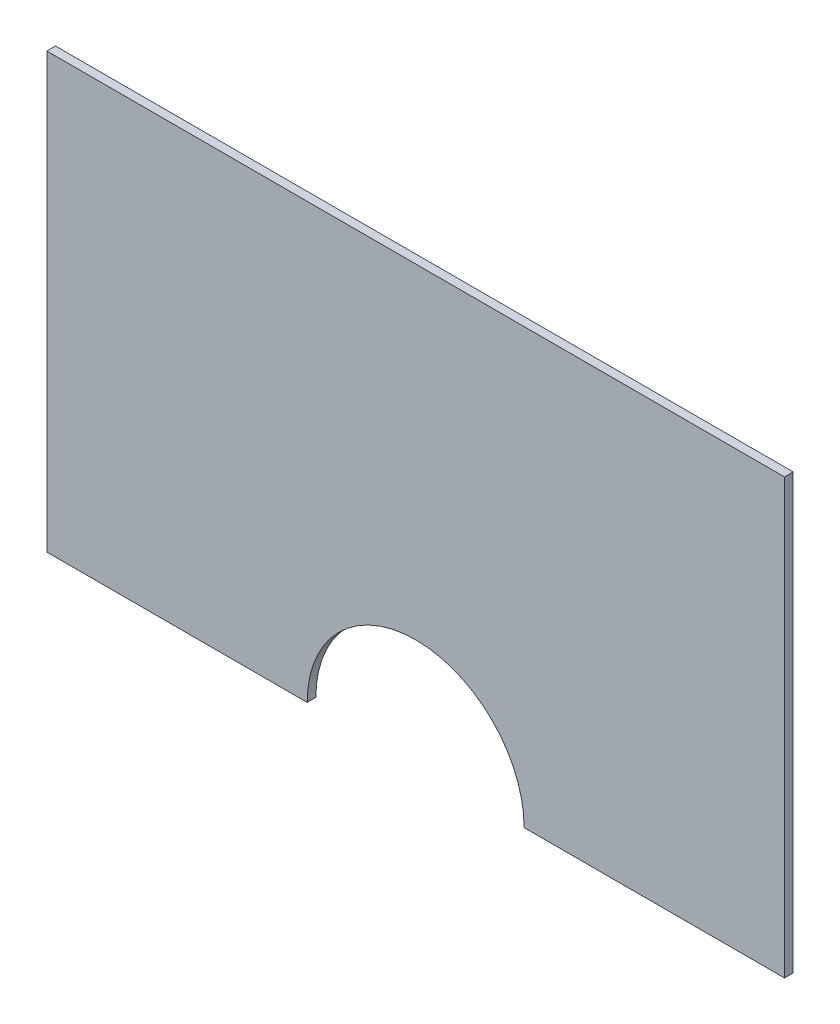
ISO-10303-21;
HEADER;
FILE_DESCRIPTION(('STEP AP214'),'2;1');
FILE_NAME('part.step','',(''),(''),'','','');
FILE_SCHEMA(('AUTOMOTIVE_DESIGN { 1 0 10303 214 1 1 1 1 }'));
ENDSEC;
DATA;
#1=APPLICATION_CONTEXT('core data for automotive mechanical design processes');
#2=APPLICATION_PROTOCOL_DEFINITION('international standard','automotive_design',2000,#1);
#3=PRODUCT_CONTEXT('',#1,'mechanical');
#4=PRODUCT('Part','Part','',(#3));
#5=PRODUCT_RELATED_PRODUCT_CATEGORY('part','',(#4));
#6=PRODUCT_DEFINITION_FORMATION('','',#4);
#7=PRODUCT_DEFINITION_CONTEXT('part definition',#1,'design');
#8=PRODUCT_DEFINITION('design','',#6,#7);
#9=PRODUCT_DEFINITION_SHAPE('','',#8);
#10=(LENGTH_UNIT() NAMED_UNIT(*) SI_UNIT(.MILLI.,.METRE.));
#11=(NAMED_UNIT(*) PLANE_ANGLE_UNIT() SI_UNIT($,.RADIAN.));
#12=(NAMED_UNIT(*) SI_UNIT($,.STERADIAN.) SOLID_ANGLE_UNIT());
#13=UNCERTAINTY_MEASURE_WITH_UNIT(LENGTH_MEASURE(1.E-05),#10,'distance_accuracy_value','');
#14=(GEOMETRIC_REPRESENTATION_CONTEXT(3) GLOBAL_UNCERTAINTY_ASSIGNED_CONTEXT((#13)) GLOBAL_UNIT_ASSIGNED_CONTEXT((#10,
#11,#12)) REPRESENTATION_CONTEXT('',''));
#15=CARTESIAN_POINT('',(0.,0.,0.));
#16=DIRECTION('',(0.,0.,1.));
#17=DIRECTION('',(1.,0.,0.));
#18=AXIS2_PLACEMENT_3D('',#15,#16,#17);
#19=CARTESIAN_POINT('',(-7.018385224495,-15.56400246464,-1.621609562546));
#20=DIRECTION('',(8.74227755256993E-08,-8.74227775882293E-08,0.999999999999992));
#21=DIRECTION('',(0.,-0.999999999999996,-8.74227775882297E-08));
#22=AXIS2_PLACEMENT_3D('',#19,#20,#21);
#23=PLANE('',#22);
#24=DIRECTION('',(1.,-1.19248797356099E-08,0.));
#25=VECTOR('',#24,1.);
#26=CARTESIAN_POINT('',(-6.593385221567,-15.3184865315,-1.621609578237));
#27=LINE('',#26,#25);
#28=CARTESIAN_POINT('',(-6.59338522113028,-15.3184865315,-1.62160959280767));
#29=VERTEX_POINT('',#28);
#30=CARTESIAN_POINT('',(-7.443385221567,-15.3184865213639,-1.62160955346733));
#31=VERTEX_POINT('',#30);
#32=EDGE_CURVE('E106',#29,#31,#27,.F.);
#33=ORIENTED_EDGE('',*,*,#32,.F.);
#34=DIRECTION('',(1.19248722316399E-08,1.,0.));
#35=VECTOR('',#34,1.);
#36=CARTESIAN_POINT('',(-6.59338522753,-15.8184865315,-1.621609621949));
#37=LINE('',#36,#35);
#38=CARTESIAN_POINT('',(-6.59338522753,-15.8184865320792,-1.62160961320667));
#39=VERTEX_POINT('',#38);
#40=EDGE_CURVE('E119',#39,#29,#37,.T.);
#41=ORIENTED_EDGE('',*,*,#40,.F.);
#42=DIRECTION('',(1.,-1.19248812390299E-08,0.));
#43=VECTOR('',#42,1.);
#44=CARTESIAN_POINT('',(-6.89338522753,-15.81848652792,-1.621609595722));
#45=LINE('',#44,#43);
#46=CARTESIAN_POINT('',(-6.89338522653332,-15.81848652792,-1.621609595722));
#47=VERTEX_POINT('',#46);
#48=EDGE_CURVE('E68',#47,#39,#45,.T.);
#49=ORIENTED_EDGE('',*,*,#48,.F.);
#50=CARTESIAN_POINT('',(-7.01838522753,-15.81848652643,-1.62160958479415));
#51=DIRECTION('',(8.74227755256993E-08,-8.74227775882293E-08,0.999999999999992));
#52=DIRECTION('',(0.,-0.999999999999996,-8.74227775882297E-08));
#53=AXIS2_PLACEMENT_3D('',#50,#51,#52);
#54=CIRCLE('',#53,0.125);
#55=CARTESIAN_POINT('',(-7.14338522753,-15.8184865249387,-1.62160956075265));
#56=VERTEX_POINT('',#55);
#57=EDGE_CURVE('E20',#47,#56,#54,.T.);
#58=ORIENTED_EDGE('',*,*,#57,.T.);
#59=DIRECTION('',(1.,-1.19248797356099E-08,0.));
#60=VECTOR('',#59,1.);
#61=CARTESIAN_POINT('',(-7.44338522753,-15.81848652136,-1.621609547639));
#62=LINE('',#61,#60);
#63=CARTESIAN_POINT('',(-7.44338522694715,-15.81848652136,-1.62160953306867));
#64=VERTEX_POINT('',#63);
#65=EDGE_CURVE('E73',#64,#56,#62,.T.);
#66=ORIENTED_EDGE('',*,*,#65,.F.);
#67=DIRECTION('',(1.19248720928599E-08,1.,0.));
#68=VECTOR('',#67,1.);
#69=CARTESIAN_POINT('',(-7.443385221567,-15.31848652136,-1.621609503928));
#70=LINE('',#69,#68);
#71=EDGE_CURVE('E81',#31,#64,#70,.F.);
#72=ORIENTED_EDGE('',*,*,#71,.F.);
#73=EDGE_LOOP('',(#33,#41,#49,#58,#66,#72));
#74=FACE_BOUND('',#73,.T.);
#75=ADVANCED_FACE('F17',(#74),#23,.F.);
#76=CARTESIAN_POINT('',(-7.443385221567,-15.31848652136,-1.621609503928));
#77=DIRECTION('',(-0.999999999999996,1.192487209286E-08,8.74227765682097E-08));
#78=DIRECTION('',(8.74227765682097E-08,0.,0.999999999999996));
#79=AXIS2_PLACEMENT_3D('',#76,#77,#78);
#80=PLANE('',#79);
#81=DIRECTION('',(0.,-0.999999999999996,-8.74227775882297E-08));
#82=VECTOR('',#81,1.);
#83=CARTESIAN_POINT('',(-7.443385220693,-15.56400246551,-1.61160952539132));
#84=LINE('',#83,#82);
#85=CARTESIAN_POINT('',(-7.44338522098433,-15.318486527304,-1.61160950392764));
#86=VERTEX_POINT('',#85);
#87=CARTESIAN_POINT('',(-7.44338522268067,-15.8184865222381,-1.61160954763902));
#88=VERTEX_POINT('',#87);
#89=EDGE_CURVE('E97',#86,#88,#84,.T.);
#90=ORIENTED_EDGE('',*,*,#89,.F.);
#91=DIRECTION('',(0.,-8.74227765457197E-08,0.999999999999996));
#92=VECTOR('',#91,1.);
#93=CARTESIAN_POINT('',(-7.443385221567,-15.3184865213639,-1.621609578237));
#94=LINE('',#93,#92);
#95=EDGE_CURVE('E103',#31,#86,#94,.T.);
#96=ORIENTED_EDGE('',*,*,#95,.F.);
#97=ORIENTED_EDGE('',*,*,#71,.T.);
#98=DIRECTION('',(0.,8.74227765457197E-08,-0.999999999999996));
#99=VECTOR('',#98,1.);
#100=CARTESIAN_POINT('',(-7.443385226656,-15.81848652136,-1.621609547639));
#101=LINE('',#100,#99);
#102=EDGE_CURVE('E79',#88,#64,#101,.T.);
#103=ORIENTED_EDGE('',*,*,#102,.F.);
#104=EDGE_LOOP('',(#90,#96,#97,#103));
#105=FACE_BOUND('',#104,.T.);
#106=ADVANCED_FACE('F155',(#105),#80,.T.);
#107=CARTESIAN_POINT('',(-7.44338522753,-15.81848652136,-1.621609547639));
#108=DIRECTION('',(-1.192487973561E-08,-0.999999999999996,-8.74227765457197E-08));
#109=DIRECTION('',(0.,8.74227765457197E-08,-0.999999999999996));
#110=AXIS2_PLACEMENT_3D('',#107,#108,#109);
#111=PLANE('',#110);
#112=DIRECTION('',(0.999999999999996,0.,-8.7422775525699E-08));
#113=VECTOR('',#112,1.);
#114=CARTESIAN_POINT('',(-7.018385223621,-15.81848652224,-1.6116095847937));
#115=LINE('',#114,#113);
#116=CARTESIAN_POINT('',(-7.14338522665577,-15.8184865240271,-1.611609573866));
#117=VERTEX_POINT('',#116);
#118=EDGE_CURVE('E100',#88,#117,#115,.T.);
#119=ORIENTED_EDGE('',*,*,#118,.F.);
#120=ORIENTED_EDGE('',*,*,#102,.T.);
#121=ORIENTED_EDGE('',*,*,#65,.T.);
#122=DIRECTION('',(8.74227755256993E-08,-8.74227775882293E-08,0.999999999999992));
#123=VECTOR('',#122,1.);
#124=CARTESIAN_POINT('',(-7.14338522753,-15.81848652494,-1.62160957386615));
#125=LINE('',#124,#123);
#126=EDGE_CURVE('E77',#56,#117,#125,.T.);
#127=ORIENTED_EDGE('',*,*,#126,.T.);
#128=EDGE_LOOP('',(#119,#120,#121,#127));
#129=FACE_BOUND('',#128,.T.);
#130=ADVANCED_FACE('F75',(#129),#111,.T.);
#131=CARTESIAN_POINT('',(-7.01838522753,-15.81848652643,-1.621609584794));
#132=DIRECTION('',(8.74227755256993E-08,-8.74227775882293E-08,0.999999999999992));
#133=DIRECTION('',(0.,-0.999999999999996,-8.74227775882297E-08));
#134=AXIS2_PLACEMENT_3D('',#131,#132,#133);
#135=CYLINDRICAL_SURFACE('',#134,0.125);
#136=DIRECTION('',(0.,8.74227765457197E-08,-0.999999999999996));
#137=VECTOR('',#136,1.);
#138=CARTESIAN_POINT('',(-6.893385226656,-15.81848652792,-1.621609595722));
#139=LINE('',#138,#137);
#140=CARTESIAN_POINT('',(-6.89338522665589,-15.8184865287971,-1.61160959572169));
#141=VERTEX_POINT('',#140);
#142=EDGE_CURVE('E121',#141,#47,#139,.T.);
#143=ORIENTED_EDGE('',*,*,#142,.F.);
#144=CARTESIAN_POINT('',(-7.01838522665577,-15.8184865273042,-1.61160958479385));
#145=DIRECTION('',(8.74227755256993E-08,-8.74227775882293E-08,0.999999999999992));
#146=DIRECTION('',(0.,-0.999999999999996,-8.74227775882297E-08));
#147=AXIS2_PLACEMENT_3D('',#144,#145,#146);
#148=CIRCLE('',#147,0.125);
#149=EDGE_CURVE('E87',#117,#141,#148,.F.);
#150=ORIENTED_EDGE('',*,*,#149,.F.);
#151=ORIENTED_EDGE('',*,*,#126,.F.);
#152=ORIENTED_EDGE('',*,*,#57,.F.);
#153=EDGE_LOOP('',(#143,#150,#151,#152));
#154=FACE_BOUND('',#153,.T.);
#155=ADVANCED_FACE('F85',(#154),#135,.F.);
#156=CARTESIAN_POINT('',(-6.89338522753,-15.81848652792,-1.621609595722));
#157=DIRECTION('',(-1.192488123903E-08,-0.999999999999996,-8.74227765457197E-08));
#158=DIRECTION('',(0.,8.74227765457197E-08,-0.999999999999996));
#159=AXIS2_PLACEMENT_3D('',#156,#157,#158);
#160=PLANE('',#159);
#161=DIRECTION('',(0.999999999999996,0.,-8.7422775525699E-08));
#162=VECTOR('',#161,1.);
#163=CARTESIAN_POINT('',(-7.018385223621,-15.8184865288,-1.6116095847937));
#164=LINE('',#163,#162);
#165=CARTESIAN_POINT('',(-6.59338522665592,-15.81848652999,-1.61160962194838));
#166=VERTEX_POINT('',#165);
#167=EDGE_CURVE('E131',#141,#166,#164,.T.);
#168=ORIENTED_EDGE('',*,*,#167,.F.);
#169=ORIENTED_EDGE('',*,*,#142,.T.);
#170=ORIENTED_EDGE('',*,*,#48,.T.);
#171=DIRECTION('',(-8.74227765682096E-08,0.,-0.999999999999996));
#172=VECTOR('',#171,1.);
#173=CARTESIAN_POINT('',(-6.59338522753,-15.81848653237,-1.621609621949));
#174=LINE('',#173,#172);
#175=EDGE_CURVE('E116',#166,#39,#174,.T.);
#176=ORIENTED_EDGE('',*,*,#175,.F.);
#177=EDGE_LOOP('',(#168,#169,#170,#176));
#178=FACE_BOUND('',#177,.T.);
#179=ADVANCED_FACE('F149',(#178),#160,.T.);
#180=CARTESIAN_POINT('',(-6.59338522753,-15.8184865315,-1.621609621949));
#181=DIRECTION('',(0.999999999999996,-1.192487223164E-08,-8.74227765682096E-08));
#182=DIRECTION('',(-8.74227765682096E-08,0.,-0.999999999999996));
#183=AXIS2_PLACEMENT_3D('',#180,#181,#182);
#184=PLANE('',#183);
#185=DIRECTION('',(0.,-0.999999999999996,-8.74227775882297E-08));
#186=VECTOR('',#185,1.);
#187=CARTESIAN_POINT('',(-6.593385226656,-15.56400246551,-1.61160959970068));
#188=LINE('',#187,#186);
#189=CARTESIAN_POINT('',(-6.59338522218392,-15.3184865319361,-1.61160955965975));
#190=VERTEX_POINT('',#189);
#191=EDGE_CURVE('E26',#166,#190,#188,.F.);
#192=ORIENTED_EDGE('',*,*,#191,.F.);
#193=ORIENTED_EDGE('',*,*,#175,.T.);
#194=ORIENTED_EDGE('',*,*,#40,.T.);
#195=DIRECTION('',(0.,-8.74227765457197E-08,0.999999999999996));
#196=VECTOR('',#195,1.);
#197=CARTESIAN_POINT('',(-6.593385220693,-15.3184865315,-1.621609578237));
#198=LINE('',#197,#196);
#199=EDGE_CURVE('E35',#190,#29,#198,.F.);
#200=ORIENTED_EDGE('',*,*,#199,.F.);
#201=EDGE_LOOP('',(#192,#193,#194,#200));
#202=FACE_BOUND('',#201,.T.);
#203=ADVANCED_FACE('F146',(#202),#184,.T.);
#204=CARTESIAN_POINT('',(-6.593385221567,-15.3184865315,-1.621609578237));
#205=DIRECTION('',(1.192487973561E-08,0.999999999999996,8.74227765457197E-08));
#206=DIRECTION('',(0.,-8.74227765457197E-08,0.999999999999996));
#207=AXIS2_PLACEMENT_3D('',#204,#205,#206);
#208=PLANE('',#207);
#209=DIRECTION('',(0.999999999999996,0.,-8.7422775525699E-08));
#210=VECTOR('',#209,1.);
#211=CARTESIAN_POINT('',(-7.018385223621,-15.31848653237,-1.61160954108232));
#212=LINE('',#211,#210);
#213=EDGE_CURVE('E11',#190,#86,#212,.F.);
#214=ORIENTED_EDGE('',*,*,#213,.F.);
#215=ORIENTED_EDGE('',*,*,#199,.T.);
#216=ORIENTED_EDGE('',*,*,#32,.T.);
#217=ORIENTED_EDGE('',*,*,#95,.T.);
#218=EDGE_LOOP('',(#214,#215,#216,#217));
#219=FACE_BOUND('',#218,.T.);
#220=ADVANCED_FACE('F152',(#219),#208,.T.);
#221=CARTESIAN_POINT('',(-7.018385223621,-15.56400246551,-1.611609562546));
#222=DIRECTION('',(8.74227755256993E-08,-8.74227775882293E-08,0.999999999999992));
#223=DIRECTION('',(0.,-0.999999999999996,-8.74227775882297E-08));
#224=AXIS2_PLACEMENT_3D('',#221,#222,#223);
#225=PLANE('',#224);
#226=ORIENTED_EDGE('',*,*,#191,.T.);
#227=ORIENTED_EDGE('',*,*,#213,.T.);
#228=ORIENTED_EDGE('',*,*,#89,.T.);
#229=ORIENTED_EDGE('',*,*,#118,.T.);
#230=ORIENTED_EDGE('',*,*,#149,.T.);
#231=ORIENTED_EDGE('',*,*,#167,.T.);
#232=EDGE_LOOP('',(#226,#227,#228,#229,#230,#231));
#233=FACE_BOUND('',#232,.T.);
#234=ADVANCED_FACE('F150',(#233),#225,.T.);
#235=CLOSED_SHELL('',(#75,#106,#130,#155,#179,#203,#220,#234));
#236=MANIFOLD_SOLID_BREP('B1',#235);
#237=ADVANCED_BREP_SHAPE_REPRESENTATION('',(#18,#236),#14);
#238=SHAPE_DEFINITION_REPRESENTATION(#9,#237);
ENDSEC;
END-ISO-10303-21;
